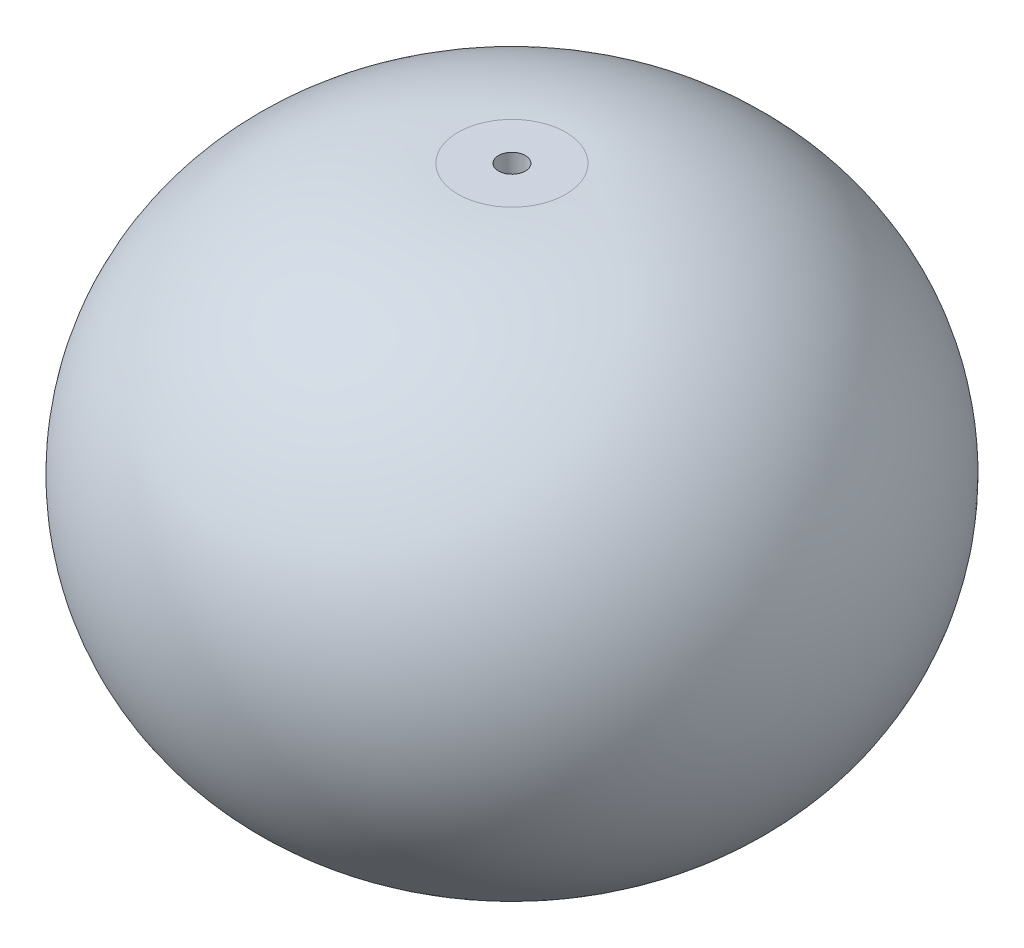
ISO-10303-21;
HEADER;
FILE_DESCRIPTION(('STEP AP214'),'2;1');
FILE_NAME('part.step','',(''),(''),'','','');
FILE_SCHEMA(('AUTOMOTIVE_DESIGN { 1 0 10303 214 1 1 1 1 }'));
ENDSEC;
DATA;
#1=APPLICATION_CONTEXT('core data for automotive mechanical design processes');
#2=APPLICATION_PROTOCOL_DEFINITION('international standard','automotive_design',2000,#1);
#3=PRODUCT_CONTEXT('',#1,'mechanical');
#4=PRODUCT('Part','Part','',(#3));
#5=PRODUCT_RELATED_PRODUCT_CATEGORY('part','',(#4));
#6=PRODUCT_DEFINITION_FORMATION('','',#4);
#7=PRODUCT_DEFINITION_CONTEXT('part definition',#1,'design');
#8=PRODUCT_DEFINITION('design','',#6,#7);
#9=PRODUCT_DEFINITION_SHAPE('','',#8);
#10=(LENGTH_UNIT() NAMED_UNIT(*) SI_UNIT(.MILLI.,.METRE.));
#11=(NAMED_UNIT(*) PLANE_ANGLE_UNIT() SI_UNIT($,.RADIAN.));
#12=(NAMED_UNIT(*) SI_UNIT($,.STERADIAN.) SOLID_ANGLE_UNIT());
#13=UNCERTAINTY_MEASURE_WITH_UNIT(LENGTH_MEASURE(1.E-05),#10,'distance_accuracy_value','');
#14=(GEOMETRIC_REPRESENTATION_CONTEXT(3) GLOBAL_UNCERTAINTY_ASSIGNED_CONTEXT((#13)) GLOBAL_UNIT_ASSIGNED_CONTEXT((#10,
#11,#12)) REPRESENTATION_CONTEXT('',''));
#15=CARTESIAN_POINT('',(0.,0.,0.));
#16=DIRECTION('',(0.,0.,1.));
#17=DIRECTION('',(1.,0.,0.));
#18=AXIS2_PLACEMENT_3D('',#15,#16,#17);
#19=CARTESIAN_POINT('',(10.16,0.,0.));
#20=DIRECTION('',(0.,0.,1.));
#21=DIRECTION('',(-1.,0.,0.));
#22=AXIS2_PLACEMENT_3D('',#19,#20,#21);
#23=ELLIPSE('',#22,52.07,50.8);
#24=TRIMMED_CURVE('',#23,(PARAMETER_VALUE(1.37441453698598)),(PARAMETER_VALUE(4.9087707701936)),
.T.,.PARAMETER.);
#25=CARTESIAN_POINT('',(0.,0.,0.));
#26=DIRECTION('',(0.,-1.,0.));
#27=AXIS1_PLACEMENT('',#25,#26);
#28=SURFACE_OF_REVOLUTION('',#24,#27);
#29=CARTESIAN_POINT('',(-1.77367252013231E-13,50.8,0.));
#30=DIRECTION('',(0.,-1.,0.));
#31=DIRECTION('',(1.,0.,0.));
#32=AXIS2_PLACEMENT_3D('',#29,#30,#31);
#33=CIRCLE('',#32,10.16);
#34=CARTESIAN_POINT('',(10.1599999999998,50.8,0.));
#35=VERTEX_POINT('',#34);
#36=EDGE_CURVE('E10',#35,#35,#33,.T.);
#37=ORIENTED_EDGE('',*,*,#36,.T.);
#38=EDGE_LOOP('',(#37));
#39=FACE_BOUND('',#38,.T.);
#40=CARTESIAN_POINT('',(1.77367252013231E-13,-50.8,0.));
#41=DIRECTION('',(0.,-1.,0.));
#42=DIRECTION('',(1.,0.,0.));
#43=AXIS2_PLACEMENT_3D('',#40,#41,#42);
#44=CIRCLE('',#43,10.16);
#45=CARTESIAN_POINT('',(10.1600000000002,-50.7999999999999,0.));
#46=VERTEX_POINT('',#45);
#47=EDGE_CURVE('E54',#46,#46,#44,.T.);
#48=ORIENTED_EDGE('',*,*,#47,.F.);
#49=EDGE_LOOP('',(#48));
#50=FACE_BOUND('',#49,.T.);
#51=ADVANCED_FACE('F33',(#39,#50),#28,.F.);
#52=CARTESIAN_POINT('',(0.,50.8,0.));
#53=DIRECTION('',(0.,-1.,0.));
#54=DIRECTION('',(1.,0.,0.));
#55=AXIS2_PLACEMENT_3D('',#52,#53,#54);
#56=PLANE('',#55);
#57=CARTESIAN_POINT('',(-1.77367252013231E-13,50.8,0.));
#58=DIRECTION('',(0.,-1.,0.));
#59=DIRECTION('',(1.,0.,0.));
#60=AXIS2_PLACEMENT_3D('',#57,#58,#59);
#61=CIRCLE('',#60,2.54);
#62=CARTESIAN_POINT('',(2.53999999999982,50.8,0.));
#63=VERTEX_POINT('',#62);
#64=EDGE_CURVE('E46',#63,#63,#61,.T.);
#65=ORIENTED_EDGE('',*,*,#64,.T.);
#66=EDGE_LOOP('',(#65));
#67=FACE_BOUND('',#66,.T.);
#68=ORIENTED_EDGE('',*,*,#36,.F.);
#69=EDGE_LOOP('',(#68));
#70=FACE_BOUND('',#69,.T.);
#71=ADVANCED_FACE('F82',(#67,#70),#56,.F.);
#72=CARTESIAN_POINT('',(-1.33025439009923E-13,38.1,0.));
#73=DIRECTION('',(0.,-1.,0.));
#74=DIRECTION('',(1.,0.,0.));
#75=AXIS2_PLACEMENT_3D('',#72,#73,#74);
#76=CYLINDRICAL_SURFACE('',#75,6.985);
#77=CARTESIAN_POINT('',(-1.33025439009923E-13,38.1,0.));
#78=DIRECTION('',(0.,-1.,0.));
#79=DIRECTION('',(1.,0.,0.));
#80=AXIS2_PLACEMENT_3D('',#77,#78,#79);
#81=CIRCLE('',#80,6.985);
#82=CARTESIAN_POINT('',(6.98499999999987,38.1,0.));
#83=VERTEX_POINT('',#82);
#84=EDGE_CURVE('E41',#83,#83,#81,.T.);
#85=CARTESIAN_POINT('',(1.33025439009923E-13,-38.1,0.));
#86=DIRECTION('',(0.,-1.,0.));
#87=DIRECTION('',(1.,0.,0.));
#88=AXIS2_PLACEMENT_3D('',#85,#86,#87);
#89=CIRCLE('',#88,6.985);
#90=CARTESIAN_POINT('',(6.98500000000013,-38.1,0.));
#91=VERTEX_POINT('',#90);
#92=EDGE_CURVE('E59',#91,#91,#89,.T.);
#93=CARTESIAN_POINT('',(6.98499999999987,38.1,0.));
#94=CARTESIAN_POINT('',(6.98499999999987,37.30625,0.));
#95=CARTESIAN_POINT('',(6.98499999999987,36.5125,0.));
#96=CARTESIAN_POINT('',(6.98499999999988,34.925,0.));
#97=CARTESIAN_POINT('',(6.98499999999988,34.13125,0.));
#98=CARTESIAN_POINT('',(6.98499999999989,32.54375,0.));
#99=CARTESIAN_POINT('',(6.98499999999989,31.75,0.));
#100=CARTESIAN_POINT('',(6.9849999999999,30.1625,0.));
#101=CARTESIAN_POINT('',(6.9849999999999,29.36875,0.));
#102=CARTESIAN_POINT('',(6.9849999999999,27.78125,0.));
#103=CARTESIAN_POINT('',(6.98499999999991,26.9875,0.));
#104=CARTESIAN_POINT('',(6.98499999999991,25.4,0.));
#105=CARTESIAN_POINT('',(6.98499999999992,24.60625,0.));
#106=CARTESIAN_POINT('',(6.98499999999992,23.01875,0.));
#107=CARTESIAN_POINT('',(6.98499999999992,22.225,0.));
#108=CARTESIAN_POINT('',(6.98499999999993,20.6375,0.));
#109=CARTESIAN_POINT('',(6.98499999999993,19.84375,0.));
#110=CARTESIAN_POINT('',(6.98499999999994,18.25625,0.));
#111=CARTESIAN_POINT('',(6.98499999999994,17.4625,0.));
#112=CARTESIAN_POINT('',(6.98499999999995,15.875,0.));
#113=CARTESIAN_POINT('',(6.98499999999995,15.08125,0.));
#114=CARTESIAN_POINT('',(6.98499999999995,13.49375,0.));
#115=CARTESIAN_POINT('',(6.98499999999996,12.7,0.));
#116=CARTESIAN_POINT('',(6.98499999999996,11.1125,0.));
#117=CARTESIAN_POINT('',(6.98499999999996,10.31875,0.));
#118=CARTESIAN_POINT('',(6.98499999999997,8.73125000000002,0.));
#119=CARTESIAN_POINT('',(6.98499999999997,7.93750000000002,0.));
#120=CARTESIAN_POINT('',(6.98499999999998,6.35000000000002,0.));
#121=CARTESIAN_POINT('',(6.98499999999998,5.55625000000003,0.));
#122=CARTESIAN_POINT('',(6.98499999999999,3.96875000000003,0.));
#123=CARTESIAN_POINT('',(6.98499999999999,3.17500000000003,0.));
#124=CARTESIAN_POINT('',(6.985,1.58750000000003,0.));
#125=CARTESIAN_POINT('',(6.985,0.793750000000028,0.));
#126=CARTESIAN_POINT('',(6.985,-0.793749999999973,0.));
#127=CARTESIAN_POINT('',(6.98500000000001,-1.58749999999997,0.));
#128=CARTESIAN_POINT('',(6.98500000000001,-3.17499999999997,0.));
#129=CARTESIAN_POINT('',(6.98500000000002,-3.96874999999997,0.));
#130=CARTESIAN_POINT('',(6.98500000000002,-5.55624999999998,0.));
#131=CARTESIAN_POINT('',(6.98500000000002,-6.34999999999998,0.));
#132=CARTESIAN_POINT('',(6.98500000000003,-7.93749999999998,0.));
#133=CARTESIAN_POINT('',(6.98500000000003,-8.73124999999998,0.));
#134=CARTESIAN_POINT('',(6.98500000000004,-10.31875,0.));
#135=CARTESIAN_POINT('',(6.98500000000004,-11.1125,0.));
#136=CARTESIAN_POINT('',(6.98500000000004,-12.7,0.));
#137=CARTESIAN_POINT('',(6.98500000000005,-13.49375,0.));
#138=CARTESIAN_POINT('',(6.98500000000005,-15.08125,0.));
#139=CARTESIAN_POINT('',(6.98500000000006,-15.875,0.));
#140=CARTESIAN_POINT('',(6.98500000000006,-17.4625,0.));
#141=CARTESIAN_POINT('',(6.98500000000007,-18.25625,0.));
#142=CARTESIAN_POINT('',(6.98500000000007,-19.84375,0.));
#143=CARTESIAN_POINT('',(6.98500000000007,-20.6375,0.));
#144=CARTESIAN_POINT('',(6.98500000000008,-22.225,0.));
#145=CARTESIAN_POINT('',(6.98500000000008,-23.01875,0.));
#146=CARTESIAN_POINT('',(6.98500000000009,-24.60625,0.));
#147=CARTESIAN_POINT('',(6.98500000000009,-25.4,0.));
#148=CARTESIAN_POINT('',(6.9850000000001,-26.9875,0.));
#149=CARTESIAN_POINT('',(6.9850000000001,-27.78125,0.));
#150=CARTESIAN_POINT('',(6.9850000000001,-29.36875,0.));
#151=CARTESIAN_POINT('',(6.98500000000011,-30.1625,0.));
#152=CARTESIAN_POINT('',(6.98500000000011,-31.75,0.));
#153=CARTESIAN_POINT('',(6.98500000000011,-32.54375,0.));
#154=CARTESIAN_POINT('',(6.98500000000012,-34.13125,0.));
#155=CARTESIAN_POINT('',(6.98500000000012,-34.925,0.));
#156=CARTESIAN_POINT('',(6.98500000000013,-36.5125,0.));
#157=CARTESIAN_POINT('',(6.98500000000013,-37.30625,0.));
#158=CARTESIAN_POINT('',(6.98500000000013,-38.1,0.));
#159=B_SPLINE_CURVE_WITH_KNOTS('',3,(#93,#94,#95,#96,#97,#98,#99,#100,#101,#102,#103,#104,#105,
#106,#107,#108,#109,#110,#111,#112,#113,#114,#115,#116,#117,#118,#119,#120,#121,#122,#123,#124,
#125,#126,#127,#128,#129,#130,#131,#132,#133,#134,#135,#136,#137,#138,#139,#140,#141,#142,#143,
#144,#145,#146,#147,#148,#149,#150,#151,#152,#153,#154,#155,#156,#157,#158),.UNSPECIFIED.,.F.,
.F.,(4,2,2,2,2,2,2,2,2,2,2,2,2,2,2,2,2,2,2,2,2,2,2,2,2,2,2,2,2,2,2,2,4),(0.,2.38125,4.7625,
7.14375,9.52500000000001,11.90625,14.2875,16.66875,19.05,21.43125,23.8125,26.19375,28.575,
30.95625,33.3375,35.71875,38.1,40.48125,42.8625,45.24375,47.625,50.00625,52.3875,54.76875,57.15,
59.53125,61.9125,64.29375,66.675,69.05625,71.4375,73.81875,76.2),.UNSPECIFIED.);
#160=EDGE_CURVE('BSEAM86',#83,#91,#159,.T.);
#161=ORIENTED_EDGE('',*,*,#84,.F.);
#162=ORIENTED_EDGE('',*,*,#92,.T.);
#163=ORIENTED_EDGE('',*,*,#160,.T.);
#164=ORIENTED_EDGE('',*,*,#160,.F.);
#165=EDGE_LOOP('',(#161,#163,#162,#164));
#166=FACE_BOUND('',#165,.T.);
#167=ADVANCED_FACE('F86',(#166),#76,.F.);
#168=CARTESIAN_POINT('',(-1.33025439009923E-13,38.1,0.));
#169=DIRECTION('',(0.,-1.,0.));
#170=DIRECTION('',(1.,0.,0.));
#171=AXIS2_PLACEMENT_3D('',#168,#169,#170);
#172=PLANE('',#171);
#173=CARTESIAN_POINT('',(-1.33025439009923E-13,38.1,0.));
#174=DIRECTION('',(0.,-1.,0.));
#175=DIRECTION('',(1.,0.,0.));
#176=AXIS2_PLACEMENT_3D('',#173,#174,#175);
#177=CIRCLE('',#176,2.54);
#178=CARTESIAN_POINT('',(2.53999999999987,38.1,0.));
#179=VERTEX_POINT('',#178);
#180=EDGE_CURVE('E50',#179,#179,#177,.T.);
#181=ORIENTED_EDGE('',*,*,#180,.F.);
#182=EDGE_LOOP('',(#181));
#183=FACE_BOUND('',#182,.T.);
#184=ORIENTED_EDGE('',*,*,#84,.T.);
#185=EDGE_LOOP('',(#184));
#186=FACE_BOUND('',#185,.T.);
#187=ADVANCED_FACE('F90',(#183,#186),#172,.T.);
#188=CARTESIAN_POINT('',(-2.66050878019847E-13,76.2,0.));
#189=DIRECTION('',(0.,-1.,0.));
#190=DIRECTION('',(1.,0.,0.));
#191=AXIS2_PLACEMENT_3D('',#188,#189,#190);
#192=CYLINDRICAL_SURFACE('',#191,2.54);
#193=CARTESIAN_POINT('',(2.53999999999987,38.1,0.));
#194=CARTESIAN_POINT('',(2.53999999999987,38.2322916666667,0.));
#195=CARTESIAN_POINT('',(2.53999999999987,38.3645833333333,0.));
#196=CARTESIAN_POINT('',(2.53999999999987,38.6291666666667,0.));
#197=CARTESIAN_POINT('',(2.53999999999987,38.7614583333333,0.));
#198=CARTESIAN_POINT('',(2.53999999999986,39.0260416666667,0.));
#199=CARTESIAN_POINT('',(2.53999999999986,39.1583333333334,0.));
#200=CARTESIAN_POINT('',(2.53999999999986,39.4229166666667,0.));
#201=CARTESIAN_POINT('',(2.53999999999986,39.5552083333333,0.));
#202=CARTESIAN_POINT('',(2.53999999999986,39.8197916666667,0.));
#203=CARTESIAN_POINT('',(2.53999999999986,39.9520833333333,0.));
#204=CARTESIAN_POINT('',(2.53999999999986,40.2166666666667,0.));
#205=CARTESIAN_POINT('',(2.53999999999986,40.3489583333333,0.));
#206=CARTESIAN_POINT('',(2.53999999999986,40.6135416666667,0.));
#207=CARTESIAN_POINT('',(2.53999999999986,40.7458333333333,0.));
#208=CARTESIAN_POINT('',(2.53999999999986,41.0104166666667,0.));
#209=CARTESIAN_POINT('',(2.53999999999986,41.1427083333333,0.));
#210=CARTESIAN_POINT('',(2.53999999999986,41.4072916666667,0.));
#211=CARTESIAN_POINT('',(2.53999999999986,41.5395833333333,0.));
#212=CARTESIAN_POINT('',(2.53999999999985,41.8041666666667,0.));
#213=CARTESIAN_POINT('',(2.53999999999985,41.9364583333333,0.));
#214=CARTESIAN_POINT('',(2.53999999999985,42.2010416666667,0.));
#215=CARTESIAN_POINT('',(2.53999999999985,42.3333333333333,0.));
#216=CARTESIAN_POINT('',(2.53999999999985,42.5979166666667,0.));
#217=CARTESIAN_POINT('',(2.53999999999985,42.7302083333333,0.));
#218=CARTESIAN_POINT('',(2.53999999999985,42.9947916666667,0.));
#219=CARTESIAN_POINT('',(2.53999999999985,43.1270833333333,0.));
#220=CARTESIAN_POINT('',(2.53999999999985,43.3916666666667,0.));
#221=CARTESIAN_POINT('',(2.53999999999985,43.5239583333333,0.));
#222=CARTESIAN_POINT('',(2.53999999999985,43.7885416666667,0.));
#223=CARTESIAN_POINT('',(2.53999999999985,43.9208333333333,0.));
#224=CARTESIAN_POINT('',(2.53999999999985,44.1854166666667,0.));
#225=CARTESIAN_POINT('',(2.53999999999985,44.3177083333333,0.));
#226=CARTESIAN_POINT('',(2.53999999999985,44.5822916666667,0.));
#227=CARTESIAN_POINT('',(2.53999999999984,44.7145833333333,0.));
#228=CARTESIAN_POINT('',(2.53999999999984,44.9791666666667,0.));
#229=CARTESIAN_POINT('',(2.53999999999984,45.1114583333333,0.));
#230=CARTESIAN_POINT('',(2.53999999999984,45.3760416666667,0.));
#231=CARTESIAN_POINT('',(2.53999999999984,45.5083333333333,0.));
#232=CARTESIAN_POINT('',(2.53999999999984,45.7729166666667,0.));
#233=CARTESIAN_POINT('',(2.53999999999984,45.9052083333333,0.));
#234=CARTESIAN_POINT('',(2.53999999999984,46.1697916666667,0.));
#235=CARTESIAN_POINT('',(2.53999999999984,46.3020833333333,0.));
#236=CARTESIAN_POINT('',(2.53999999999984,46.5666666666667,0.));
#237=CARTESIAN_POINT('',(2.53999999999984,46.6989583333333,0.));
#238=CARTESIAN_POINT('',(2.53999999999984,46.9635416666667,0.));
#239=CARTESIAN_POINT('',(2.53999999999984,47.0958333333333,0.));
#240=CARTESIAN_POINT('',(2.53999999999983,47.3604166666667,0.));
#241=CARTESIAN_POINT('',(2.53999999999983,47.4927083333333,0.));
#242=CARTESIAN_POINT('',(2.53999999999983,47.7572916666667,0.));
#243=CARTESIAN_POINT('',(2.53999999999983,47.8895833333333,0.));
#244=CARTESIAN_POINT('',(2.53999999999983,48.1541666666667,0.));
#245=CARTESIAN_POINT('',(2.53999999999983,48.2864583333333,0.));
#246=CARTESIAN_POINT('',(2.53999999999983,48.5510416666667,0.));
#247=CARTESIAN_POINT('',(2.53999999999983,48.6833333333333,0.));
#248=CARTESIAN_POINT('',(2.53999999999983,48.9479166666667,0.));
#249=CARTESIAN_POINT('',(2.53999999999983,49.0802083333333,0.));
#250=CARTESIAN_POINT('',(2.53999999999983,49.3447916666667,0.));
#251=CARTESIAN_POINT('',(2.53999999999983,49.4770833333333,0.));
#252=CARTESIAN_POINT('',(2.53999999999983,49.7416666666667,0.));
#253=CARTESIAN_POINT('',(2.53999999999983,49.8739583333333,0.));
#254=CARTESIAN_POINT('',(2.53999999999983,50.1385416666667,0.));
#255=CARTESIAN_POINT('',(2.53999999999983,50.2708333333333,0.));
#256=CARTESIAN_POINT('',(2.53999999999982,50.5354166666667,0.));
#257=CARTESIAN_POINT('',(2.53999999999982,50.6677083333333,0.));
#258=CARTESIAN_POINT('',(2.53999999999982,50.8,0.));
#259=B_SPLINE_CURVE_WITH_KNOTS('',3,(#193,#194,#195,#196,#197,#198,#199,#200,#201,#202,#203,
#204,#205,#206,#207,#208,#209,#210,#211,#212,#213,#214,#215,#216,#217,#218,#219,#220,#221,#222,
#223,#224,#225,#226,#227,#228,#229,#230,#231,#232,#233,#234,#235,#236,#237,#238,#239,#240,#241,
#242,#243,#244,#245,#246,#247,#248,#249,#250,#251,#252,#253,#254,#255,#256,#257,#258),
.UNSPECIFIED.,.F.,.F.,(4,2,2,2,2,2,2,2,2,2,2,2,2,2,2,2,2,2,2,2,2,2,2,2,2,2,2,2,2,2,2,2,4),(0.,
0.396874999999998,0.793749999999996,1.190625,1.5875,1.984375,2.38124999999999,2.77812499999999,
3.175,3.571875,3.96874999999999,4.36562499999999,4.76249999999999,5.15937499999999,
5.55624999999999,5.95312499999999,6.34999999999999,6.74687499999999,7.14374999999998,
7.54062499999998,7.93749999999998,8.33437499999998,8.73124999999997,9.12812499999998,
9.52499999999998,9.92187499999998,10.31875,10.715625,11.1125,11.509375,11.90625,12.303125,12.7),.UNSPECIFIED.);
#260=EDGE_CURVE('BSEAM77',#179,#63,#259,.T.);
#261=ORIENTED_EDGE('',*,*,#180,.T.);
#262=ORIENTED_EDGE('',*,*,#64,.F.);
#263=ORIENTED_EDGE('',*,*,#260,.T.);
#264=ORIENTED_EDGE('',*,*,#260,.F.);
#265=EDGE_LOOP('',(#261,#263,#262,#264));
#266=FACE_BOUND('',#265,.T.);
#267=ADVANCED_FACE('F77',(#266),#192,.F.);
#268=CARTESIAN_POINT('',(3.54734504026462E-13,-50.8,0.));
#269=DIRECTION('',(0.,1.,0.));
#270=DIRECTION('',(1.,0.,0.));
#271=AXIS2_PLACEMENT_3D('',#268,#269,#270);
#272=PLANE('',#271);
#273=CARTESIAN_POINT('',(1.77367252013231E-13,-50.8,0.));
#274=DIRECTION('',(0.,1.,0.));
#275=DIRECTION('',(-1.,0.,0.));
#276=AXIS2_PLACEMENT_3D('',#273,#274,#275);
#277=CIRCLE('',#276,2.54);
#278=CARTESIAN_POINT('',(-2.53999999999982,-50.8,0.));
#279=VERTEX_POINT('',#278);
#280=EDGE_CURVE('E37',#279,#279,#277,.F.);
#281=ORIENTED_EDGE('',*,*,#280,.F.);
#282=EDGE_LOOP('',(#281));
#283=FACE_BOUND('',#282,.T.);
#284=ORIENTED_EDGE('',*,*,#47,.T.);
#285=EDGE_LOOP('',(#284));
#286=FACE_BOUND('',#285,.T.);
#287=ADVANCED_FACE('F73',(#283,#286),#272,.F.);
#288=CARTESIAN_POINT('',(1.33025439009923E-13,-38.1,0.));
#289=DIRECTION('',(0.,1.,0.));
#290=DIRECTION('',(1.,0.,0.));
#291=AXIS2_PLACEMENT_3D('',#288,#289,#290);
#292=PLANE('',#291);
#293=CARTESIAN_POINT('',(1.33025439009923E-13,-38.1,0.));
#294=DIRECTION('',(0.,-1.,0.));
#295=DIRECTION('',(1.,0.,0.));
#296=AXIS2_PLACEMENT_3D('',#293,#294,#295);
#297=CIRCLE('',#296,2.54);
#298=CARTESIAN_POINT('',(-2.53999999999987,-38.1,0.));
#299=VERTEX_POINT('',#298);
#300=EDGE_CURVE('E64',#299,#299,#297,.T.);
#301=ORIENTED_EDGE('',*,*,#300,.T.);
#302=EDGE_LOOP('',(#301));
#303=FACE_BOUND('',#302,.T.);
#304=ORIENTED_EDGE('',*,*,#92,.F.);
#305=EDGE_LOOP('',(#304));
#306=FACE_BOUND('',#305,.T.);
#307=ADVANCED_FACE('F76',(#303,#306),#292,.T.);
#308=CARTESIAN_POINT('',(2.66050878019847E-13,-76.2,0.));
#309=DIRECTION('',(0.,1.,0.));
#310=DIRECTION('',(-1.,0.,0.));
#311=AXIS2_PLACEMENT_3D('',#308,#309,#310);
#312=CYLINDRICAL_SURFACE('',#311,2.54);
#313=CARTESIAN_POINT('',(-2.53999999999987,-38.1,0.));
#314=CARTESIAN_POINT('',(-2.53999999999987,-38.2322916666667,0.));
#315=CARTESIAN_POINT('',(-2.53999999999987,-38.3645833333333,0.));
#316=CARTESIAN_POINT('',(-2.53999999999987,-38.6291666666667,0.));
#317=CARTESIAN_POINT('',(-2.53999999999987,-38.7614583333333,0.));
#318=CARTESIAN_POINT('',(-2.53999999999986,-39.0260416666667,0.));
#319=CARTESIAN_POINT('',(-2.53999999999986,-39.1583333333334,0.));
#320=CARTESIAN_POINT('',(-2.53999999999986,-39.4229166666667,0.));
#321=CARTESIAN_POINT('',(-2.53999999999986,-39.5552083333333,0.));
#322=CARTESIAN_POINT('',(-2.53999999999986,-39.8197916666667,0.));
#323=CARTESIAN_POINT('',(-2.53999999999986,-39.9520833333333,0.));
#324=CARTESIAN_POINT('',(-2.53999999999986,-40.2166666666667,0.));
#325=CARTESIAN_POINT('',(-2.53999999999986,-40.3489583333333,0.));
#326=CARTESIAN_POINT('',(-2.53999999999986,-40.6135416666667,0.));
#327=CARTESIAN_POINT('',(-2.53999999999986,-40.7458333333333,0.));
#328=CARTESIAN_POINT('',(-2.53999999999986,-41.0104166666667,0.));
#329=CARTESIAN_POINT('',(-2.53999999999986,-41.1427083333333,0.));
#330=CARTESIAN_POINT('',(-2.53999999999986,-41.4072916666667,0.));
#331=CARTESIAN_POINT('',(-2.53999999999986,-41.5395833333333,0.));
#332=CARTESIAN_POINT('',(-2.53999999999985,-41.8041666666667,0.));
#333=CARTESIAN_POINT('',(-2.53999999999985,-41.9364583333333,0.));
#334=CARTESIAN_POINT('',(-2.53999999999985,-42.2010416666667,0.));
#335=CARTESIAN_POINT('',(-2.53999999999985,-42.3333333333333,0.));
#336=CARTESIAN_POINT('',(-2.53999999999985,-42.5979166666667,0.));
#337=CARTESIAN_POINT('',(-2.53999999999985,-42.7302083333333,0.));
#338=CARTESIAN_POINT('',(-2.53999999999985,-42.9947916666667,0.));
#339=CARTESIAN_POINT('',(-2.53999999999985,-43.1270833333333,0.));
#340=CARTESIAN_POINT('',(-2.53999999999985,-43.3916666666667,0.));
#341=CARTESIAN_POINT('',(-2.53999999999985,-43.5239583333333,0.));
#342=CARTESIAN_POINT('',(-2.53999999999985,-43.7885416666667,0.));
#343=CARTESIAN_POINT('',(-2.53999999999985,-43.9208333333333,0.));
#344=CARTESIAN_POINT('',(-2.53999999999985,-44.1854166666667,0.));
#345=CARTESIAN_POINT('',(-2.53999999999985,-44.3177083333333,0.));
#346=CARTESIAN_POINT('',(-2.53999999999985,-44.5822916666667,0.));
#347=CARTESIAN_POINT('',(-2.53999999999984,-44.7145833333333,0.));
#348=CARTESIAN_POINT('',(-2.53999999999984,-44.9791666666667,0.));
#349=CARTESIAN_POINT('',(-2.53999999999984,-45.1114583333333,0.));
#350=CARTESIAN_POINT('',(-2.53999999999984,-45.3760416666667,0.));
#351=CARTESIAN_POINT('',(-2.53999999999984,-45.5083333333333,0.));
#352=CARTESIAN_POINT('',(-2.53999999999984,-45.7729166666667,0.));
#353=CARTESIAN_POINT('',(-2.53999999999984,-45.9052083333333,0.));
#354=CARTESIAN_POINT('',(-2.53999999999984,-46.1697916666667,0.));
#355=CARTESIAN_POINT('',(-2.53999999999984,-46.3020833333333,0.));
#356=CARTESIAN_POINT('',(-2.53999999999984,-46.5666666666667,0.));
#357=CARTESIAN_POINT('',(-2.53999999999984,-46.6989583333333,0.));
#358=CARTESIAN_POINT('',(-2.53999999999984,-46.9635416666667,0.));
#359=CARTESIAN_POINT('',(-2.53999999999984,-47.0958333333333,0.));
#360=CARTESIAN_POINT('',(-2.53999999999983,-47.3604166666667,0.));
#361=CARTESIAN_POINT('',(-2.53999999999983,-47.4927083333333,0.));
#362=CARTESIAN_POINT('',(-2.53999999999983,-47.7572916666667,0.));
#363=CARTESIAN_POINT('',(-2.53999999999983,-47.8895833333333,0.));
#364=CARTESIAN_POINT('',(-2.53999999999983,-48.1541666666667,0.));
#365=CARTESIAN_POINT('',(-2.53999999999983,-48.2864583333333,0.));
#366=CARTESIAN_POINT('',(-2.53999999999983,-48.5510416666667,0.));
#367=CARTESIAN_POINT('',(-2.53999999999983,-48.6833333333333,0.));
#368=CARTESIAN_POINT('',(-2.53999999999983,-48.9479166666667,0.));
#369=CARTESIAN_POINT('',(-2.53999999999983,-49.0802083333333,0.));
#370=CARTESIAN_POINT('',(-2.53999999999983,-49.3447916666667,0.));
#371=CARTESIAN_POINT('',(-2.53999999999983,-49.4770833333333,0.));
#372=CARTESIAN_POINT('',(-2.53999999999983,-49.7416666666667,0.));
#373=CARTESIAN_POINT('',(-2.53999999999983,-49.8739583333333,0.));
#374=CARTESIAN_POINT('',(-2.53999999999983,-50.1385416666667,0.));
#375=CARTESIAN_POINT('',(-2.53999999999983,-50.2708333333333,0.));
#376=CARTESIAN_POINT('',(-2.53999999999982,-50.5354166666667,0.));
#377=CARTESIAN_POINT('',(-2.53999999999982,-50.6677083333333,0.));
#378=CARTESIAN_POINT('',(-2.53999999999982,-50.8,0.));
#379=B_SPLINE_CURVE_WITH_KNOTS('',3,(#313,#314,#315,#316,#317,#318,#319,#320,#321,#322,#323,
#324,#325,#326,#327,#328,#329,#330,#331,#332,#333,#334,#335,#336,#337,#338,#339,#340,#341,#342,
#343,#344,#345,#346,#347,#348,#349,#350,#351,#352,#353,#354,#355,#356,#357,#358,#359,#360,#361,
#362,#363,#364,#365,#366,#367,#368,#369,#370,#371,#372,#373,#374,#375,#376,#377,#378),
.UNSPECIFIED.,.F.,.F.,(4,2,2,2,2,2,2,2,2,2,2,2,2,2,2,2,2,2,2,2,2,2,2,2,2,2,2,2,2,2,2,2,4),(0.,
0.396874999999998,0.793749999999996,1.190625,1.5875,1.984375,2.38124999999999,2.77812499999999,
3.175,3.571875,3.96874999999999,4.36562499999999,4.76249999999999,5.15937499999999,
5.55624999999999,5.95312499999999,6.34999999999999,6.74687499999999,7.14374999999998,
7.54062499999998,7.93749999999998,8.33437499999998,8.73124999999997,9.12812499999998,
9.52499999999998,9.92187499999998,10.31875,10.715625,11.1125,11.509375,11.90625,12.303125,12.7),.UNSPECIFIED.);
#380=EDGE_CURVE('BSEAM71',#299,#279,#379,.T.);
#381=ORIENTED_EDGE('',*,*,#300,.F.);
#382=ORIENTED_EDGE('',*,*,#280,.T.);
#383=ORIENTED_EDGE('',*,*,#380,.T.);
#384=ORIENTED_EDGE('',*,*,#380,.F.);
#385=EDGE_LOOP('',(#381,#383,#382,#384));
#386=FACE_BOUND('',#385,.T.);
#387=ADVANCED_FACE('F71',(#386),#312,.F.);
#388=CLOSED_SHELL('',(#51,#71,#167,#187,#267,#287,#307,#387));
#389=MANIFOLD_SOLID_BREP('B2',#388);
#390=ADVANCED_BREP_SHAPE_REPRESENTATION('',(#18,#389),#14);
#391=SHAPE_DEFINITION_REPRESENTATION(#9,#390);
ENDSEC;
END-ISO-10303-21;
